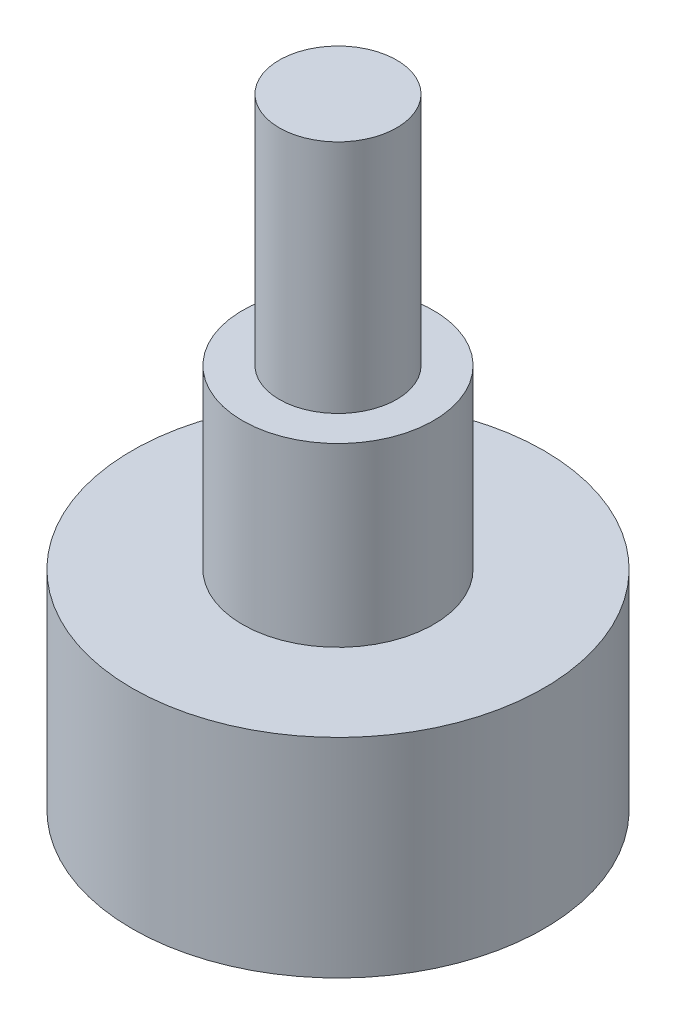
ISO-10303-21;
HEADER;
FILE_DESCRIPTION(('STEP AP214'),'2;1');
FILE_NAME('part.step','',(''),(''),'','','');
FILE_SCHEMA(('AUTOMOTIVE_DESIGN { 1 0 10303 214 1 1 1 1 }'));
ENDSEC;
DATA;
#1=APPLICATION_CONTEXT('core data for automotive mechanical design processes');
#2=APPLICATION_PROTOCOL_DEFINITION('international standard','automotive_design',2000,#1);
#3=PRODUCT_CONTEXT('',#1,'mechanical');
#4=PRODUCT('Part','Part','',(#3));
#5=PRODUCT_RELATED_PRODUCT_CATEGORY('part','',(#4));
#6=PRODUCT_DEFINITION_FORMATION('','',#4);
#7=PRODUCT_DEFINITION_CONTEXT('part definition',#1,'design');
#8=PRODUCT_DEFINITION('design','',#6,#7);
#9=PRODUCT_DEFINITION_SHAPE('','',#8);
#10=(LENGTH_UNIT() NAMED_UNIT(*) SI_UNIT(.MILLI.,.METRE.));
#11=(NAMED_UNIT(*) PLANE_ANGLE_UNIT() SI_UNIT($,.RADIAN.));
#12=(NAMED_UNIT(*) SI_UNIT($,.STERADIAN.) SOLID_ANGLE_UNIT());
#13=UNCERTAINTY_MEASURE_WITH_UNIT(LENGTH_MEASURE(1.E-05),#10,'distance_accuracy_value','');
#14=(GEOMETRIC_REPRESENTATION_CONTEXT(3) GLOBAL_UNCERTAINTY_ASSIGNED_CONTEXT((#13)) GLOBAL_UNIT_ASSIGNED_CONTEXT((#10,
#11,#12)) REPRESENTATION_CONTEXT('',''));
#15=CARTESIAN_POINT('',(0.,0.,0.));
#16=DIRECTION('',(0.,0.,1.));
#17=DIRECTION('',(1.,0.,0.));
#18=AXIS2_PLACEMENT_3D('',#15,#16,#17);
#19=CARTESIAN_POINT('',(0.,11.25,0.));
#20=DIRECTION('',(0.,-1.,0.));
#21=DIRECTION('',(0.,0.,-1.));
#22=AXIS2_PLACEMENT_3D('',#19,#20,#21);
#23=CYLINDRICAL_SURFACE('',#22,11.115);
#24=CARTESIAN_POINT('',(0.,11.25,0.));
#25=DIRECTION('',(0.,1.,0.));
#26=DIRECTION('',(0.,0.,1.));
#27=AXIS2_PLACEMENT_3D('',#24,#25,#26);
#28=CIRCLE('',#27,11.115);
#29=CARTESIAN_POINT('',(0.,11.25,-11.115));
#30=VERTEX_POINT('',#29);
#31=EDGE_CURVE('E49',#30,#30,#28,.T.);
#32=CARTESIAN_POINT('',(0.,0.,0.));
#33=DIRECTION('',(0.,1.,0.));
#34=DIRECTION('',(0.,0.,1.));
#35=AXIS2_PLACEMENT_3D('',#32,#33,#34);
#36=CIRCLE('',#35,11.115);
#37=CARTESIAN_POINT('',(0.,0.,-11.115));
#38=VERTEX_POINT('',#37);
#39=EDGE_CURVE('E55',#38,#38,#36,.T.);
#40=CARTESIAN_POINT('',(0.,11.25,-11.115));
#41=CARTESIAN_POINT('',(0.,11.1328125,-11.115));
#42=CARTESIAN_POINT('',(0.,11.015625,-11.115));
#43=CARTESIAN_POINT('',(0.,10.78125,-11.115));
#44=CARTESIAN_POINT('',(0.,10.6640625,-11.115));
#45=CARTESIAN_POINT('',(0.,10.4296875,-11.115));
#46=CARTESIAN_POINT('',(0.,10.3125,-11.115));
#47=CARTESIAN_POINT('',(0.,10.078125,-11.115));
#48=CARTESIAN_POINT('',(0.,9.9609375,-11.115));
#49=CARTESIAN_POINT('',(0.,9.7265625,-11.115));
#50=CARTESIAN_POINT('',(0.,9.609375,-11.115));
#51=CARTESIAN_POINT('',(0.,9.375,-11.115));
#52=CARTESIAN_POINT('',(0.,9.2578125,-11.115));
#53=CARTESIAN_POINT('',(0.,9.0234375,-11.115));
#54=CARTESIAN_POINT('',(0.,8.90625,-11.115));
#55=CARTESIAN_POINT('',(0.,8.671875,-11.115));
#56=CARTESIAN_POINT('',(0.,8.5546875,-11.115));
#57=CARTESIAN_POINT('',(0.,8.3203125,-11.115));
#58=CARTESIAN_POINT('',(0.,8.203125,-11.115));
#59=CARTESIAN_POINT('',(0.,7.96875,-11.115));
#60=CARTESIAN_POINT('',(0.,7.8515625,-11.115));
#61=CARTESIAN_POINT('',(0.,7.6171875,-11.115));
#62=CARTESIAN_POINT('',(0.,7.5,-11.115));
#63=CARTESIAN_POINT('',(0.,7.265625,-11.115));
#64=CARTESIAN_POINT('',(0.,7.1484375,-11.115));
#65=CARTESIAN_POINT('',(0.,6.9140625,-11.115));
#66=CARTESIAN_POINT('',(0.,6.796875,-11.115));
#67=CARTESIAN_POINT('',(0.,6.5625,-11.115));
#68=CARTESIAN_POINT('',(0.,6.4453125,-11.115));
#69=CARTESIAN_POINT('',(0.,6.2109375,-11.115));
#70=CARTESIAN_POINT('',(0.,6.09375,-11.115));
#71=CARTESIAN_POINT('',(0.,5.859375,-11.115));
#72=CARTESIAN_POINT('',(0.,5.7421875,-11.115));
#73=CARTESIAN_POINT('',(0.,5.5078125,-11.115));
#74=CARTESIAN_POINT('',(0.,5.390625,-11.115));
#75=CARTESIAN_POINT('',(0.,5.15625,-11.115));
#76=CARTESIAN_POINT('',(0.,5.0390625,-11.115));
#77=CARTESIAN_POINT('',(0.,4.8046875,-11.115));
#78=CARTESIAN_POINT('',(0.,4.6875,-11.115));
#79=CARTESIAN_POINT('',(0.,4.453125,-11.115));
#80=CARTESIAN_POINT('',(0.,4.3359375,-11.115));
#81=CARTESIAN_POINT('',(0.,4.1015625,-11.115));
#82=CARTESIAN_POINT('',(0.,3.984375,-11.115));
#83=CARTESIAN_POINT('',(0.,3.75,-11.115));
#84=CARTESIAN_POINT('',(0.,3.6328125,-11.115));
#85=CARTESIAN_POINT('',(0.,3.3984375,-11.115));
#86=CARTESIAN_POINT('',(0.,3.28125,-11.115));
#87=CARTESIAN_POINT('',(0.,3.046875,-11.115));
#88=CARTESIAN_POINT('',(0.,2.9296875,-11.115));
#89=CARTESIAN_POINT('',(0.,2.6953125,-11.115));
#90=CARTESIAN_POINT('',(0.,2.578125,-11.115));
#91=CARTESIAN_POINT('',(0.,2.34375,-11.115));
#92=CARTESIAN_POINT('',(0.,2.2265625,-11.115));
#93=CARTESIAN_POINT('',(0.,1.9921875,-11.115));
#94=CARTESIAN_POINT('',(0.,1.875,-11.115));
#95=CARTESIAN_POINT('',(0.,1.640625,-11.115));
#96=CARTESIAN_POINT('',(0.,1.5234375,-11.115));
#97=CARTESIAN_POINT('',(0.,1.2890625,-11.115));
#98=CARTESIAN_POINT('',(0.,1.171875,-11.115));
#99=CARTESIAN_POINT('',(0.,0.937499999999999,-11.115));
#100=CARTESIAN_POINT('',(0.,0.820312499999999,-11.115));
#101=CARTESIAN_POINT('',(0.,0.585937499999998,-11.115));
#102=CARTESIAN_POINT('',(0.,0.468749999999998,-11.115));
#103=CARTESIAN_POINT('',(0.,0.234374999999998,-11.115));
#104=CARTESIAN_POINT('',(0.,0.117187499999998,-11.115));
#105=CARTESIAN_POINT('',(0.,0.,-11.115));
#106=B_SPLINE_CURVE_WITH_KNOTS('',3,(#40,#41,#42,#43,#44,#45,#46,#47,#48,#49,#50,#51,#52,#53,
#54,#55,#56,#57,#58,#59,#60,#61,#62,#63,#64,#65,#66,#67,#68,#69,#70,#71,#72,#73,#74,#75,#76,#77,
#78,#79,#80,#81,#82,#83,#84,#85,#86,#87,#88,#89,#90,#91,#92,#93,#94,#95,#96,#97,#98,#99,#100,
#101,#102,#103,#104,#105),.UNSPECIFIED.,.F.,.F.,(4,2,2,2,2,2,2,2,2,2,2,2,2,2,2,2,2,2,2,2,2,2,2,
2,2,2,2,2,2,2,2,2,4),(0.,0.351562499999999,0.703124999999999,1.0546875,1.40625,1.7578125,
2.109375,2.4609375,2.8125,3.1640625,3.515625,3.8671875,4.21875,4.5703125,4.921875,5.2734375,
5.625,5.9765625,6.328125,6.6796875,7.03125,7.3828125,7.734375,8.0859375,8.4375,8.7890625,
9.140625,9.4921875,9.84375,10.1953125,10.546875,10.8984375,11.25),.UNSPECIFIED.);
#107=EDGE_CURVE('BSEAM41',#30,#38,#106,.T.);
#108=ORIENTED_EDGE('',*,*,#31,.F.);
#109=ORIENTED_EDGE('',*,*,#39,.T.);
#110=ORIENTED_EDGE('',*,*,#107,.T.);
#111=ORIENTED_EDGE('',*,*,#107,.F.);
#112=EDGE_LOOP('',(#108,#110,#109,#111));
#113=FACE_BOUND('',#112,.T.);
#114=ADVANCED_FACE('F41',(#113),#23,.T.);
#115=CARTESIAN_POINT('',(0.,11.25,0.));
#116=DIRECTION('',(0.,1.,0.));
#117=DIRECTION('',(0.,0.,1.));
#118=AXIS2_PLACEMENT_3D('',#115,#116,#117);
#119=PLANE('',#118);
#120=CARTESIAN_POINT('',(0.,11.25,0.));
#121=DIRECTION('',(0.,1.,0.));
#122=DIRECTION('',(0.,0.,1.));
#123=AXIS2_PLACEMENT_3D('',#120,#121,#122);
#124=CIRCLE('',#123,5.1585);
#125=CARTESIAN_POINT('',(0.,11.25,5.1585));
#126=VERTEX_POINT('',#125);
#127=EDGE_CURVE('E10',#126,#126,#124,.T.);
#128=ORIENTED_EDGE('',*,*,#127,.F.);
#129=EDGE_LOOP('',(#128));
#130=FACE_BOUND('',#129,.T.);
#131=ORIENTED_EDGE('',*,*,#31,.T.);
#132=EDGE_LOOP('',(#131));
#133=FACE_BOUND('',#132,.T.);
#134=ADVANCED_FACE('F93',(#130,#133),#119,.T.);
#135=CARTESIAN_POINT('',(0.,0.,0.));
#136=DIRECTION('',(0.,1.,0.));
#137=DIRECTION('',(0.,0.,1.));
#138=AXIS2_PLACEMENT_3D('',#135,#136,#137);
#139=PLANE('',#138);
#140=ORIENTED_EDGE('',*,*,#39,.F.);
#141=EDGE_LOOP('',(#140));
#142=FACE_BOUND('',#141,.T.);
#143=ADVANCED_FACE('F98',(#142),#139,.F.);
#144=CARTESIAN_POINT('',(0.,20.78,0.));
#145=DIRECTION('',(0.,-1.,0.));
#146=DIRECTION('',(0.,0.,-1.));
#147=AXIS2_PLACEMENT_3D('',#144,#145,#146);
#148=CYLINDRICAL_SURFACE('',#147,5.1585);
#149=CARTESIAN_POINT('',(0.,20.78,0.));
#150=DIRECTION('',(0.,1.,0.));
#151=DIRECTION('',(0.,0.,1.));
#152=AXIS2_PLACEMENT_3D('',#149,#150,#151);
#153=CIRCLE('',#152,5.1585);
#154=CARTESIAN_POINT('',(0.,20.78,5.1585));
#155=VERTEX_POINT('',#154);
#156=EDGE_CURVE('E58',#155,#155,#153,.T.);
#157=ORIENTED_EDGE('',*,*,#156,.F.);
#158=EDGE_LOOP('',(#157));
#159=FACE_BOUND('',#158,.T.);
#160=ORIENTED_EDGE('',*,*,#127,.T.);
#161=EDGE_LOOP('',(#160));
#162=FACE_BOUND('',#161,.T.);
#163=ADVANCED_FACE('F90',(#159,#162),#148,.T.);
#164=CARTESIAN_POINT('',(0.,20.78,0.));
#165=DIRECTION('',(0.,1.,0.));
#166=DIRECTION('',(0.,0.,1.));
#167=AXIS2_PLACEMENT_3D('',#164,#165,#166);
#168=PLANE('',#167);
#169=CARTESIAN_POINT('',(0.,20.78,0.));
#170=DIRECTION('',(0.,1.,0.));
#171=DIRECTION('',(0.,0.,1.));
#172=AXIS2_PLACEMENT_3D('',#169,#170,#171);
#173=CIRCLE('',#172,3.171);
#174=CARTESIAN_POINT('',(0.,20.78,3.171));
#175=VERTEX_POINT('',#174);
#176=EDGE_CURVE('E44',#175,#175,#173,.F.);
#177=ORIENTED_EDGE('',*,*,#176,.T.);
#178=EDGE_LOOP('',(#177));
#179=FACE_BOUND('',#178,.T.);
#180=ORIENTED_EDGE('',*,*,#156,.T.);
#181=EDGE_LOOP('',(#180));
#182=FACE_BOUND('',#181,.T.);
#183=ADVANCED_FACE('F81',(#179,#182),#168,.T.);
#184=CARTESIAN_POINT('',(0.,33.48,0.));
#185=DIRECTION('',(0.,-1.,0.));
#186=DIRECTION('',(0.,0.,-1.));
#187=AXIS2_PLACEMENT_3D('',#184,#185,#186);
#188=CYLINDRICAL_SURFACE('',#187,3.171);
#189=ORIENTED_EDGE('',*,*,#176,.F.);
#190=EDGE_LOOP('',(#189));
#191=FACE_BOUND('',#190,.T.);
#192=CARTESIAN_POINT('',(0.,33.48,0.));
#193=DIRECTION('',(0.,1.,0.));
#194=DIRECTION('',(0.,0.,1.));
#195=AXIS2_PLACEMENT_3D('',#192,#193,#194);
#196=CIRCLE('',#195,3.171);
#197=CARTESIAN_POINT('',(0.,33.48,3.171));
#198=VERTEX_POINT('',#197);
#199=EDGE_CURVE('E70',#198,#198,#196,.T.);
#200=ORIENTED_EDGE('',*,*,#199,.F.);
#201=EDGE_LOOP('',(#200));
#202=FACE_BOUND('',#201,.T.);
#203=ADVANCED_FACE('F79',(#191,#202),#188,.T.);
#204=CARTESIAN_POINT('',(0.,33.48,0.));
#205=DIRECTION('',(0.,1.,0.));
#206=DIRECTION('',(0.,0.,1.));
#207=AXIS2_PLACEMENT_3D('',#204,#205,#206);
#208=PLANE('',#207);
#209=ORIENTED_EDGE('',*,*,#199,.T.);
#210=EDGE_LOOP('',(#209));
#211=FACE_BOUND('',#210,.T.);
#212=ADVANCED_FACE('F77',(#211),#208,.T.);
#213=CLOSED_SHELL('',(#114,#134,#143,#163,#183,#203,#212));
#214=MANIFOLD_SOLID_BREP('B2',#213);
#215=ADVANCED_BREP_SHAPE_REPRESENTATION('',(#18,#214),#14);
#216=SHAPE_DEFINITION_REPRESENTATION(#9,#215);
ENDSEC;
END-ISO-10303-21;
